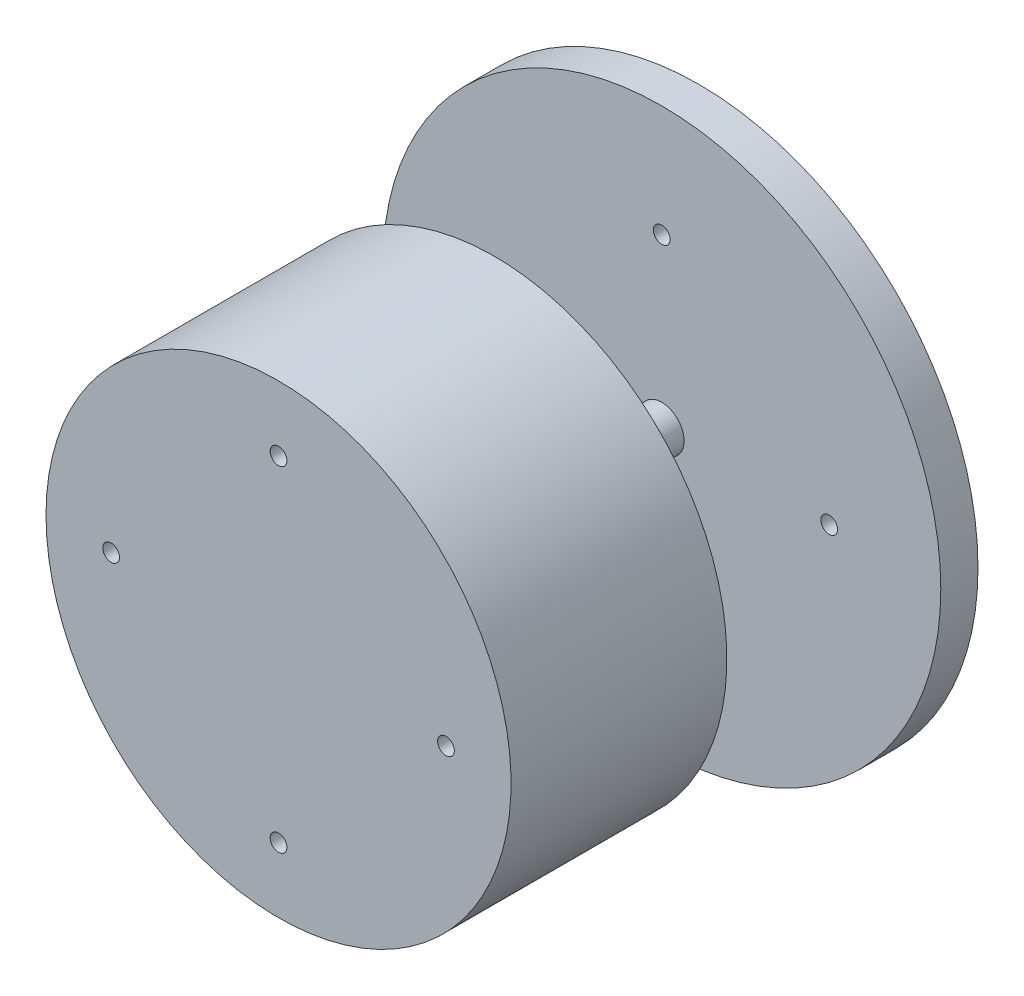
ISO-10303-21;
HEADER;
FILE_DESCRIPTION(('STEP AP214'),'2;1');
FILE_NAME('part.step','',(''),(''),'','','');
FILE_SCHEMA(('AUTOMOTIVE_DESIGN { 1 0 10303 214 1 1 1 1 }'));
ENDSEC;
DATA;
#1=APPLICATION_CONTEXT('core data for automotive mechanical design processes');
#2=APPLICATION_PROTOCOL_DEFINITION('international standard','automotive_design',2000,#1);
#3=PRODUCT_CONTEXT('',#1,'mechanical');
#4=PRODUCT('Part','Part','',(#3));
#5=PRODUCT_RELATED_PRODUCT_CATEGORY('part','',(#4));
#6=PRODUCT_DEFINITION_FORMATION('','',#4);
#7=PRODUCT_DEFINITION_CONTEXT('part definition',#1,'design');
#8=PRODUCT_DEFINITION('design','',#6,#7);
#9=PRODUCT_DEFINITION_SHAPE('','',#8);
#10=(LENGTH_UNIT() NAMED_UNIT(*) SI_UNIT(.MILLI.,.METRE.));
#11=(NAMED_UNIT(*) PLANE_ANGLE_UNIT() SI_UNIT($,.RADIAN.));
#12=(NAMED_UNIT(*) SI_UNIT($,.STERADIAN.) SOLID_ANGLE_UNIT());
#13=UNCERTAINTY_MEASURE_WITH_UNIT(LENGTH_MEASURE(1.E-05),#10,'distance_accuracy_value','');
#14=(GEOMETRIC_REPRESENTATION_CONTEXT(3) GLOBAL_UNCERTAINTY_ASSIGNED_CONTEXT((#13)) GLOBAL_UNIT_ASSIGNED_CONTEXT((#10,
#11,#12)) REPRESENTATION_CONTEXT('',''));
#15=CARTESIAN_POINT('',(0.,0.,0.));
#16=DIRECTION('',(0.,0.,1.));
#17=DIRECTION('',(1.,0.,0.));
#18=AXIS2_PLACEMENT_3D('',#15,#16,#17);
#19=CARTESIAN_POINT('',(300.,300.,113.));
#20=DIRECTION('',(0.,0.,-1.));
#21=DIRECTION('',(-1.,0.,0.));
#22=AXIS2_PLACEMENT_3D('',#19,#20,#21);
#23=CYLINDRICAL_SURFACE('',#22,62.5);
#24=CARTESIAN_POINT('',(300.,300.,113.));
#25=DIRECTION('',(0.,0.,1.));
#26=DIRECTION('',(1.,0.,0.));
#27=AXIS2_PLACEMENT_3D('',#24,#25,#26);
#28=CIRCLE('',#27,62.5);
#29=CARTESIAN_POINT('',(237.5,300.,113.));
#30=VERTEX_POINT('',#29);
#31=EDGE_CURVE('E42',#30,#30,#28,.T.);
#32=CARTESIAN_POINT('',(300.,300.,55.));
#33=DIRECTION('',(0.,0.,1.));
#34=DIRECTION('',(1.,0.,0.));
#35=AXIS2_PLACEMENT_3D('',#32,#33,#34);
#36=CIRCLE('',#35,62.5);
#37=CARTESIAN_POINT('',(237.5,300.,55.));
#38=VERTEX_POINT('',#37);
#39=EDGE_CURVE('E47',#38,#38,#36,.T.);
#40=CARTESIAN_POINT('',(237.5,300.,113.));
#41=CARTESIAN_POINT('',(237.5,300.,112.395833333333));
#42=CARTESIAN_POINT('',(237.5,300.,111.791666666667));
#43=CARTESIAN_POINT('',(237.5,300.,110.583333333333));
#44=CARTESIAN_POINT('',(237.5,300.,109.979166666667));
#45=CARTESIAN_POINT('',(237.5,300.,108.770833333333));
#46=CARTESIAN_POINT('',(237.5,300.,108.166666666667));
#47=CARTESIAN_POINT('',(237.5,300.,106.958333333333));
#48=CARTESIAN_POINT('',(237.5,300.,106.354166666667));
#49=CARTESIAN_POINT('',(237.5,300.,105.145833333333));
#50=CARTESIAN_POINT('',(237.5,300.,104.541666666667));
#51=CARTESIAN_POINT('',(237.5,300.,103.333333333333));
#52=CARTESIAN_POINT('',(237.5,300.,102.729166666667));
#53=CARTESIAN_POINT('',(237.5,300.,101.520833333333));
#54=CARTESIAN_POINT('',(237.5,300.,100.916666666667));
#55=CARTESIAN_POINT('',(237.5,300.,99.7083333333333));
#56=CARTESIAN_POINT('',(237.5,300.,99.1041666666667));
#57=CARTESIAN_POINT('',(237.5,300.,97.8958333333333));
#58=CARTESIAN_POINT('',(237.5,300.,97.2916666666667));
#59=CARTESIAN_POINT('',(237.5,300.,96.0833333333333));
#60=CARTESIAN_POINT('',(237.5,300.,95.4791666666667));
#61=CARTESIAN_POINT('',(237.5,300.,94.2708333333333));
#62=CARTESIAN_POINT('',(237.5,300.,93.6666666666667));
#63=CARTESIAN_POINT('',(237.5,300.,92.4583333333333));
#64=CARTESIAN_POINT('',(237.5,300.,91.8541666666667));
#65=CARTESIAN_POINT('',(237.5,300.,90.6458333333333));
#66=CARTESIAN_POINT('',(237.5,300.,90.0416666666667));
#67=CARTESIAN_POINT('',(237.5,300.,88.8333333333333));
#68=CARTESIAN_POINT('',(237.5,300.,88.2291666666667));
#69=CARTESIAN_POINT('',(237.5,300.,87.0208333333333));
#70=CARTESIAN_POINT('',(237.5,300.,86.4166666666667));
#71=CARTESIAN_POINT('',(237.5,300.,85.2083333333333));
#72=CARTESIAN_POINT('',(237.5,300.,84.6041666666667));
#73=CARTESIAN_POINT('',(237.5,300.,83.3958333333333));
#74=CARTESIAN_POINT('',(237.5,300.,82.7916666666667));
#75=CARTESIAN_POINT('',(237.5,300.,81.5833333333333));
#76=CARTESIAN_POINT('',(237.5,300.,80.9791666666667));
#77=CARTESIAN_POINT('',(237.5,300.,79.7708333333333));
#78=CARTESIAN_POINT('',(237.5,300.,79.1666666666667));
#79=CARTESIAN_POINT('',(237.5,300.,77.9583333333333));
#80=CARTESIAN_POINT('',(237.5,300.,77.3541666666667));
#81=CARTESIAN_POINT('',(237.5,300.,76.1458333333333));
#82=CARTESIAN_POINT('',(237.5,300.,75.5416666666667));
#83=CARTESIAN_POINT('',(237.5,300.,74.3333333333333));
#84=CARTESIAN_POINT('',(237.5,300.,73.7291666666667));
#85=CARTESIAN_POINT('',(237.5,300.,72.5208333333333));
#86=CARTESIAN_POINT('',(237.5,300.,71.9166666666667));
#87=CARTESIAN_POINT('',(237.5,300.,70.7083333333333));
#88=CARTESIAN_POINT('',(237.5,300.,70.1041666666667));
#89=CARTESIAN_POINT('',(237.5,300.,68.8958333333333));
#90=CARTESIAN_POINT('',(237.5,300.,68.2916666666667));
#91=CARTESIAN_POINT('',(237.5,300.,67.0833333333333));
#92=CARTESIAN_POINT('',(237.5,300.,66.4791666666667));
#93=CARTESIAN_POINT('',(237.5,300.,65.2708333333333));
#94=CARTESIAN_POINT('',(237.5,300.,64.6666666666667));
#95=CARTESIAN_POINT('',(237.5,300.,63.4583333333333));
#96=CARTESIAN_POINT('',(237.5,300.,62.8541666666667));
#97=CARTESIAN_POINT('',(237.5,300.,61.6458333333333));
#98=CARTESIAN_POINT('',(237.5,300.,61.0416666666667));
#99=CARTESIAN_POINT('',(237.5,300.,59.8333333333333));
#100=CARTESIAN_POINT('',(237.5,300.,59.2291666666667));
#101=CARTESIAN_POINT('',(237.5,300.,58.0208333333333));
#102=CARTESIAN_POINT('',(237.5,300.,57.4166666666667));
#103=CARTESIAN_POINT('',(237.5,300.,56.2083333333333));
#104=CARTESIAN_POINT('',(237.5,300.,55.6041666666667));
#105=CARTESIAN_POINT('',(237.5,300.,55.));
#106=B_SPLINE_CURVE_WITH_KNOTS('',3,(#40,#41,#42,#43,#44,#45,#46,#47,#48,#49,#50,#51,#52,#53,
#54,#55,#56,#57,#58,#59,#60,#61,#62,#63,#64,#65,#66,#67,#68,#69,#70,#71,#72,#73,#74,#75,#76,#77,
#78,#79,#80,#81,#82,#83,#84,#85,#86,#87,#88,#89,#90,#91,#92,#93,#94,#95,#96,#97,#98,#99,#100,
#101,#102,#103,#104,#105),.UNSPECIFIED.,.F.,.F.,(4,2,2,2,2,2,2,2,2,2,2,2,2,2,2,2,2,2,2,2,2,2,2,
2,2,2,2,2,2,2,2,2,4),(0.,1.81250000000001,3.625,5.43750000000001,7.25000000000001,9.0625,10.875,
12.6875,14.5,16.3125,18.125,19.9375,21.75,23.5625,25.375,27.1875,29.,30.8125,32.625,34.4375,
36.25,38.0625,39.875,41.6875,43.5,45.3125,47.125,48.9375,50.75,52.5625,54.375,56.1875,58.),.UNSPECIFIED.);
#107=EDGE_CURVE('BSEAM40',#30,#38,#106,.T.);
#108=ORIENTED_EDGE('',*,*,#31,.F.);
#109=ORIENTED_EDGE('',*,*,#39,.T.);
#110=ORIENTED_EDGE('',*,*,#107,.T.);
#111=ORIENTED_EDGE('',*,*,#107,.F.);
#112=EDGE_LOOP('',(#108,#110,#109,#111));
#113=FACE_BOUND('',#112,.T.);
#114=ADVANCED_FACE('F40',(#113),#23,.T.);
#115=CARTESIAN_POINT('',(300.,300.,113.));
#116=DIRECTION('',(0.,0.,1.));
#117=DIRECTION('',(1.,0.,0.));
#118=AXIS2_PLACEMENT_3D('',#115,#116,#117);
#119=PLANE('',#118);
#120=CARTESIAN_POINT('',(300.,255.,113.));
#121=DIRECTION('',(0.,0.,1.));
#122=DIRECTION('',(1.,0.,0.));
#123=AXIS2_PLACEMENT_3D('',#120,#121,#122);
#124=CIRCLE('',#123,2.24999999999996);
#125=CARTESIAN_POINT('',(302.25,255.,113.));
#126=VERTEX_POINT('',#125);
#127=EDGE_CURVE('E246',#126,#126,#124,.T.);
#128=ORIENTED_EDGE('',*,*,#127,.F.);
#129=EDGE_LOOP('',(#128));
#130=FACE_BOUND('',#129,.T.);
#131=CARTESIAN_POINT('',(300.,345.,113.));
#132=DIRECTION('',(0.,0.,1.));
#133=DIRECTION('',(1.,0.,0.));
#134=AXIS2_PLACEMENT_3D('',#131,#132,#133);
#135=CIRCLE('',#134,2.24999999999996);
#136=CARTESIAN_POINT('',(302.25,345.,113.));
#137=VERTEX_POINT('',#136);
#138=EDGE_CURVE('E68',#137,#137,#135,.T.);
#139=ORIENTED_EDGE('',*,*,#138,.F.);
#140=EDGE_LOOP('',(#139));
#141=FACE_BOUND('',#140,.T.);
#142=CARTESIAN_POINT('',(255.,300.,113.));
#143=DIRECTION('',(0.,0.,1.));
#144=DIRECTION('',(1.,0.,0.));
#145=AXIS2_PLACEMENT_3D('',#142,#143,#144);
#146=CIRCLE('',#145,2.24999999999996);
#147=CARTESIAN_POINT('',(257.25,300.,113.));
#148=VERTEX_POINT('',#147);
#149=EDGE_CURVE('E62',#148,#148,#146,.T.);
#150=ORIENTED_EDGE('',*,*,#149,.F.);
#151=EDGE_LOOP('',(#150));
#152=FACE_BOUND('',#151,.T.);
#153=CARTESIAN_POINT('',(345.,300.,113.));
#154=DIRECTION('',(0.,0.,1.));
#155=DIRECTION('',(1.,0.,0.));
#156=AXIS2_PLACEMENT_3D('',#153,#154,#155);
#157=CIRCLE('',#156,2.24999999999996);
#158=CARTESIAN_POINT('',(347.25,300.,113.));
#159=VERTEX_POINT('',#158);
#160=EDGE_CURVE('E64',#159,#159,#157,.T.);
#161=ORIENTED_EDGE('',*,*,#160,.F.);
#162=EDGE_LOOP('',(#161));
#163=FACE_BOUND('',#162,.T.);
#164=ORIENTED_EDGE('',*,*,#31,.T.);
#165=EDGE_LOOP('',(#164));
#166=FACE_BOUND('',#165,.T.);
#167=ADVANCED_FACE('F129',(#130,#141,#152,#163,#166),#119,.T.);
#168=CARTESIAN_POINT('',(300.,300.,55.));
#169=DIRECTION('',(0.,0.,1.));
#170=DIRECTION('',(1.,0.,0.));
#171=AXIS2_PLACEMENT_3D('',#168,#169,#170);
#172=PLANE('',#171);
#173=CARTESIAN_POINT('',(300.,255.,55.));
#174=DIRECTION('',(0.,0.,1.));
#175=DIRECTION('',(1.,0.,0.));
#176=AXIS2_PLACEMENT_3D('',#173,#174,#175);
#177=CIRCLE('',#176,2.24999999999996);
#178=CARTESIAN_POINT('',(302.25,255.,55.));
#179=VERTEX_POINT('',#178);
#180=EDGE_CURVE('E79',#179,#179,#177,.T.);
#181=ORIENTED_EDGE('',*,*,#180,.T.);
#182=EDGE_LOOP('',(#181));
#183=FACE_BOUND('',#182,.T.);
#184=CARTESIAN_POINT('',(300.,345.,55.));
#185=DIRECTION('',(0.,0.,1.));
#186=DIRECTION('',(1.,0.,0.));
#187=AXIS2_PLACEMENT_3D('',#184,#185,#186);
#188=CIRCLE('',#187,2.24999999999996);
#189=CARTESIAN_POINT('',(302.25,345.,55.));
#190=VERTEX_POINT('',#189);
#191=EDGE_CURVE('E71',#190,#190,#188,.T.);
#192=ORIENTED_EDGE('',*,*,#191,.T.);
#193=EDGE_LOOP('',(#192));
#194=FACE_BOUND('',#193,.T.);
#195=CARTESIAN_POINT('',(255.,300.,55.));
#196=DIRECTION('',(0.,0.,1.));
#197=DIRECTION('',(1.,0.,0.));
#198=AXIS2_PLACEMENT_3D('',#195,#196,#197);
#199=CIRCLE('',#198,2.24999999999996);
#200=CARTESIAN_POINT('',(257.25,300.,55.));
#201=VERTEX_POINT('',#200);
#202=EDGE_CURVE('E93',#201,#201,#199,.T.);
#203=ORIENTED_EDGE('',*,*,#202,.T.);
#204=EDGE_LOOP('',(#203));
#205=FACE_BOUND('',#204,.T.);
#206=CARTESIAN_POINT('',(345.,300.,55.));
#207=DIRECTION('',(0.,0.,1.));
#208=DIRECTION('',(1.,0.,0.));
#209=AXIS2_PLACEMENT_3D('',#206,#207,#208);
#210=CIRCLE('',#209,2.24999999999996);
#211=CARTESIAN_POINT('',(347.25,300.,55.));
#212=VERTEX_POINT('',#211);
#213=EDGE_CURVE('E98',#212,#212,#210,.T.);
#214=ORIENTED_EDGE('',*,*,#213,.T.);
#215=EDGE_LOOP('',(#214));
#216=FACE_BOUND('',#215,.T.);
#217=CARTESIAN_POINT('',(300.,300.,55.));
#218=DIRECTION('',(0.,0.,1.));
#219=DIRECTION('',(1.,0.,0.));
#220=AXIS2_PLACEMENT_3D('',#217,#218,#219);
#221=CIRCLE('',#220,5.99999999999999);
#222=CARTESIAN_POINT('',(306.,300.,55.));
#223=VERTEX_POINT('',#222);
#224=EDGE_CURVE('E10',#223,#223,#221,.F.);
#225=ORIENTED_EDGE('',*,*,#224,.F.);
#226=EDGE_LOOP('',(#225));
#227=FACE_BOUND('',#226,.T.);
#228=ORIENTED_EDGE('',*,*,#39,.F.);
#229=EDGE_LOOP('',(#228));
#230=FACE_BOUND('',#229,.T.);
#231=ADVANCED_FACE('F132',(#183,#194,#205,#216,#227,#230),#172,.F.);
#232=CARTESIAN_POINT('',(300.,300.,113.));
#233=DIRECTION('',(0.,0.,-1.));
#234=DIRECTION('',(-1.,0.,0.));
#235=AXIS2_PLACEMENT_3D('',#232,#233,#234);
#236=CYLINDRICAL_SURFACE('',#235,5.99999999999999);
#237=CARTESIAN_POINT('',(300.,300.,9.99999999999999));
#238=DIRECTION('',(0.,0.,1.));
#239=DIRECTION('',(1.,0.,0.));
#240=AXIS2_PLACEMENT_3D('',#237,#238,#239);
#241=CIRCLE('',#240,5.99999999999999);
#242=CARTESIAN_POINT('',(306.,300.,9.99999999999999));
#243=VERTEX_POINT('',#242);
#244=EDGE_CURVE('E52',#243,#243,#241,.T.);
#245=ORIENTED_EDGE('',*,*,#244,.T.);
#246=EDGE_LOOP('',(#245));
#247=FACE_BOUND('',#246,.T.);
#248=ORIENTED_EDGE('',*,*,#224,.T.);
#249=EDGE_LOOP('',(#248));
#250=FACE_BOUND('',#249,.T.);
#251=ADVANCED_FACE('F145',(#247,#250),#236,.T.);
#252=CARTESIAN_POINT('',(300.,300.,10.));
#253=DIRECTION('',(0.,0.,-1.));
#254=DIRECTION('',(-1.,0.,0.));
#255=AXIS2_PLACEMENT_3D('',#252,#253,#254);
#256=CYLINDRICAL_SURFACE('',#255,75.);
#257=CARTESIAN_POINT('',(300.,300.,10.));
#258=DIRECTION('',(0.,0.,1.));
#259=DIRECTION('',(1.,0.,0.));
#260=AXIS2_PLACEMENT_3D('',#257,#258,#259);
#261=CIRCLE('',#260,75.);
#262=CARTESIAN_POINT('',(375.,300.,10.));
#263=VERTEX_POINT('',#262);
#264=EDGE_CURVE('E57',#263,#263,#261,.T.);
#265=ORIENTED_EDGE('',*,*,#264,.F.);
#266=EDGE_LOOP('',(#265));
#267=FACE_BOUND('',#266,.T.);
#268=CARTESIAN_POINT('',(300.,300.,0.));
#269=DIRECTION('',(0.,0.,1.));
#270=DIRECTION('',(1.,0.,0.));
#271=AXIS2_PLACEMENT_3D('',#268,#269,#270);
#272=CIRCLE('',#271,75.);
#273=CARTESIAN_POINT('',(375.,300.,0.));
#274=VERTEX_POINT('',#273);
#275=EDGE_CURVE('E101',#274,#274,#272,.T.);
#276=ORIENTED_EDGE('',*,*,#275,.T.);
#277=EDGE_LOOP('',(#276));
#278=FACE_BOUND('',#277,.T.);
#279=ADVANCED_FACE('F110',(#267,#278),#256,.T.);
#280=CARTESIAN_POINT('',(300.,300.,10.));
#281=DIRECTION('',(0.,0.,1.));
#282=DIRECTION('',(1.,0.,0.));
#283=AXIS2_PLACEMENT_3D('',#280,#281,#282);
#284=PLANE('',#283);
#285=CARTESIAN_POINT('',(300.,255.,10.));
#286=DIRECTION('',(0.,0.,1.));
#287=DIRECTION('',(1.,0.,0.));
#288=AXIS2_PLACEMENT_3D('',#285,#286,#287);
#289=CIRCLE('',#288,2.24999999999996);
#290=CARTESIAN_POINT('',(302.25,255.,10.));
#291=VERTEX_POINT('',#290);
#292=EDGE_CURVE('E81',#291,#291,#289,.T.);
#293=ORIENTED_EDGE('',*,*,#292,.F.);
#294=EDGE_LOOP('',(#293));
#295=FACE_BOUND('',#294,.T.);
#296=CARTESIAN_POINT('',(300.,345.,10.));
#297=DIRECTION('',(0.,0.,1.));
#298=DIRECTION('',(1.,0.,0.));
#299=AXIS2_PLACEMENT_3D('',#296,#297,#298);
#300=CIRCLE('',#299,2.24999999999996);
#301=CARTESIAN_POINT('',(302.25,345.,10.));
#302=VERTEX_POINT('',#301);
#303=EDGE_CURVE('E67',#302,#302,#300,.T.);
#304=ORIENTED_EDGE('',*,*,#303,.F.);
#305=EDGE_LOOP('',(#304));
#306=FACE_BOUND('',#305,.T.);
#307=CARTESIAN_POINT('',(255.,300.,10.));
#308=DIRECTION('',(0.,0.,1.));
#309=DIRECTION('',(1.,0.,0.));
#310=AXIS2_PLACEMENT_3D('',#307,#308,#309);
#311=CIRCLE('',#310,2.24999999999996);
#312=CARTESIAN_POINT('',(257.25,300.,10.));
#313=VERTEX_POINT('',#312);
#314=EDGE_CURVE('E63',#313,#313,#311,.T.);
#315=ORIENTED_EDGE('',*,*,#314,.F.);
#316=EDGE_LOOP('',(#315));
#317=FACE_BOUND('',#316,.T.);
#318=CARTESIAN_POINT('',(345.,300.,10.));
#319=DIRECTION('',(0.,0.,1.));
#320=DIRECTION('',(1.,0.,0.));
#321=AXIS2_PLACEMENT_3D('',#318,#319,#320);
#322=CIRCLE('',#321,2.24999999999996);
#323=CARTESIAN_POINT('',(347.25,300.,10.));
#324=VERTEX_POINT('',#323);
#325=EDGE_CURVE('E58',#324,#324,#322,.T.);
#326=ORIENTED_EDGE('',*,*,#325,.F.);
#327=EDGE_LOOP('',(#326));
#328=FACE_BOUND('',#327,.T.);
#329=ORIENTED_EDGE('',*,*,#244,.F.);
#330=EDGE_LOOP('',(#329));
#331=FACE_BOUND('',#330,.T.);
#332=ORIENTED_EDGE('',*,*,#264,.T.);
#333=EDGE_LOOP('',(#332));
#334=FACE_BOUND('',#333,.T.);
#335=ADVANCED_FACE('F115',(#295,#306,#317,#328,#331,#334),#284,.T.);
#336=CARTESIAN_POINT('',(300.,300.,0.));
#337=DIRECTION('',(0.,0.,1.));
#338=DIRECTION('',(1.,0.,0.));
#339=AXIS2_PLACEMENT_3D('',#336,#337,#338);
#340=PLANE('',#339);
#341=CARTESIAN_POINT('',(300.,255.,0.));
#342=DIRECTION('',(0.,0.,1.));
#343=DIRECTION('',(1.,0.,0.));
#344=AXIS2_PLACEMENT_3D('',#341,#342,#343);
#345=CIRCLE('',#344,2.24999999999996);
#346=CARTESIAN_POINT('',(302.25,255.,0.));
#347=VERTEX_POINT('',#346);
#348=EDGE_CURVE('E37',#347,#347,#345,.T.);
#349=ORIENTED_EDGE('',*,*,#348,.T.);
#350=EDGE_LOOP('',(#349));
#351=FACE_BOUND('',#350,.T.);
#352=CARTESIAN_POINT('',(300.,345.,0.));
#353=DIRECTION('',(0.,0.,1.));
#354=DIRECTION('',(1.,0.,0.));
#355=AXIS2_PLACEMENT_3D('',#352,#353,#354);
#356=CIRCLE('',#355,2.24999999999996);
#357=CARTESIAN_POINT('',(302.25,345.,0.));
#358=VERTEX_POINT('',#357);
#359=EDGE_CURVE('E66',#358,#358,#356,.T.);
#360=ORIENTED_EDGE('',*,*,#359,.T.);
#361=EDGE_LOOP('',(#360));
#362=FACE_BOUND('',#361,.T.);
#363=CARTESIAN_POINT('',(255.,300.,0.));
#364=DIRECTION('',(0.,0.,1.));
#365=DIRECTION('',(1.,0.,0.));
#366=AXIS2_PLACEMENT_3D('',#363,#364,#365);
#367=CIRCLE('',#366,2.24999999999996);
#368=CARTESIAN_POINT('',(257.25,300.,0.));
#369=VERTEX_POINT('',#368);
#370=EDGE_CURVE('E61',#369,#369,#367,.T.);
#371=ORIENTED_EDGE('',*,*,#370,.T.);
#372=EDGE_LOOP('',(#371));
#373=FACE_BOUND('',#372,.T.);
#374=CARTESIAN_POINT('',(345.,300.,0.));
#375=DIRECTION('',(0.,0.,1.));
#376=DIRECTION('',(1.,0.,0.));
#377=AXIS2_PLACEMENT_3D('',#374,#375,#376);
#378=CIRCLE('',#377,2.24999999999996);
#379=CARTESIAN_POINT('',(347.25,300.,0.));
#380=VERTEX_POINT('',#379);
#381=EDGE_CURVE('E60',#380,#380,#378,.T.);
#382=ORIENTED_EDGE('',*,*,#381,.T.);
#383=EDGE_LOOP('',(#382));
#384=FACE_BOUND('',#383,.T.);
#385=ORIENTED_EDGE('',*,*,#275,.F.);
#386=EDGE_LOOP('',(#385));
#387=FACE_BOUND('',#386,.T.);
#388=ADVANCED_FACE('F108',(#351,#362,#373,#384,#387),#340,.F.);
#389=CARTESIAN_POINT('',(345.,300.,-20.));
#390=DIRECTION('',(0.,0.,1.));
#391=DIRECTION('',(1.,0.,0.));
#392=AXIS2_PLACEMENT_3D('',#389,#390,#391);
#393=CYLINDRICAL_SURFACE('',#392,2.24999999999996);
#394=ORIENTED_EDGE('',*,*,#325,.T.);
#395=EDGE_LOOP('',(#394));
#396=FACE_BOUND('',#395,.T.);
#397=ORIENTED_EDGE('',*,*,#381,.F.);
#398=EDGE_LOOP('',(#397));
#399=FACE_BOUND('',#398,.T.);
#400=ADVANCED_FACE('F112',(#396,#399),#393,.F.);
#401=ORIENTED_EDGE('',*,*,#160,.T.);
#402=EDGE_LOOP('',(#401));
#403=FACE_BOUND('',#402,.T.);
#404=ORIENTED_EDGE('',*,*,#213,.F.);
#405=EDGE_LOOP('',(#404));
#406=FACE_BOUND('',#405,.T.);
#407=ADVANCED_FACE('F117',(#403,#406),#393,.F.);
#408=CARTESIAN_POINT('',(255.,300.,-20.));
#409=DIRECTION('',(0.,0.,1.));
#410=DIRECTION('',(1.,0.,0.));
#411=AXIS2_PLACEMENT_3D('',#408,#409,#410);
#412=CYLINDRICAL_SURFACE('',#411,2.24999999999996);
#413=ORIENTED_EDGE('',*,*,#314,.T.);
#414=EDGE_LOOP('',(#413));
#415=FACE_BOUND('',#414,.T.);
#416=ORIENTED_EDGE('',*,*,#370,.F.);
#417=EDGE_LOOP('',(#416));
#418=FACE_BOUND('',#417,.T.);
#419=ADVANCED_FACE('F157',(#415,#418),#412,.F.);
#420=ORIENTED_EDGE('',*,*,#149,.T.);
#421=EDGE_LOOP('',(#420));
#422=FACE_BOUND('',#421,.T.);
#423=ORIENTED_EDGE('',*,*,#202,.F.);
#424=EDGE_LOOP('',(#423));
#425=FACE_BOUND('',#424,.T.);
#426=ADVANCED_FACE('F163',(#422,#425),#412,.F.);
#427=CARTESIAN_POINT('',(300.,345.,-20.));
#428=DIRECTION('',(0.,0.,1.));
#429=DIRECTION('',(1.,0.,0.));
#430=AXIS2_PLACEMENT_3D('',#427,#428,#429);
#431=CYLINDRICAL_SURFACE('',#430,2.24999999999996);
#432=ORIENTED_EDGE('',*,*,#303,.T.);
#433=EDGE_LOOP('',(#432));
#434=FACE_BOUND('',#433,.T.);
#435=ORIENTED_EDGE('',*,*,#359,.F.);
#436=EDGE_LOOP('',(#435));
#437=FACE_BOUND('',#436,.T.);
#438=ADVANCED_FACE('F206',(#434,#437),#431,.F.);
#439=ORIENTED_EDGE('',*,*,#138,.T.);
#440=EDGE_LOOP('',(#439));
#441=FACE_BOUND('',#440,.T.);
#442=ORIENTED_EDGE('',*,*,#191,.F.);
#443=EDGE_LOOP('',(#442));
#444=FACE_BOUND('',#443,.T.);
#445=ADVANCED_FACE('F214',(#441,#444),#431,.F.);
#446=CARTESIAN_POINT('',(300.,255.,-20.));
#447=DIRECTION('',(0.,0.,1.));
#448=DIRECTION('',(1.,0.,0.));
#449=AXIS2_PLACEMENT_3D('',#446,#447,#448);
#450=CYLINDRICAL_SURFACE('',#449,2.24999999999996);
#451=ORIENTED_EDGE('',*,*,#292,.T.);
#452=EDGE_LOOP('',(#451));
#453=FACE_BOUND('',#452,.T.);
#454=ORIENTED_EDGE('',*,*,#348,.F.);
#455=EDGE_LOOP('',(#454));
#456=FACE_BOUND('',#455,.T.);
#457=ADVANCED_FACE('F221',(#453,#456),#450,.F.);
#458=ORIENTED_EDGE('',*,*,#127,.T.);
#459=EDGE_LOOP('',(#458));
#460=FACE_BOUND('',#459,.T.);
#461=ORIENTED_EDGE('',*,*,#180,.F.);
#462=EDGE_LOOP('',(#461));
#463=FACE_BOUND('',#462,.T.);
#464=ADVANCED_FACE('F231',(#460,#463),#450,.F.);
#465=CLOSED_SHELL('',(#114,#167,#231,#251,#279,#335,#388,#400,#407,#419,#426,#438,#445,#457,#464));
#466=MANIFOLD_SOLID_BREP('B2',#465);
#467=ADVANCED_BREP_SHAPE_REPRESENTATION('',(#18,#466),#14);
#468=SHAPE_DEFINITION_REPRESENTATION(#9,#467);
ENDSEC;
END-ISO-10303-21;
